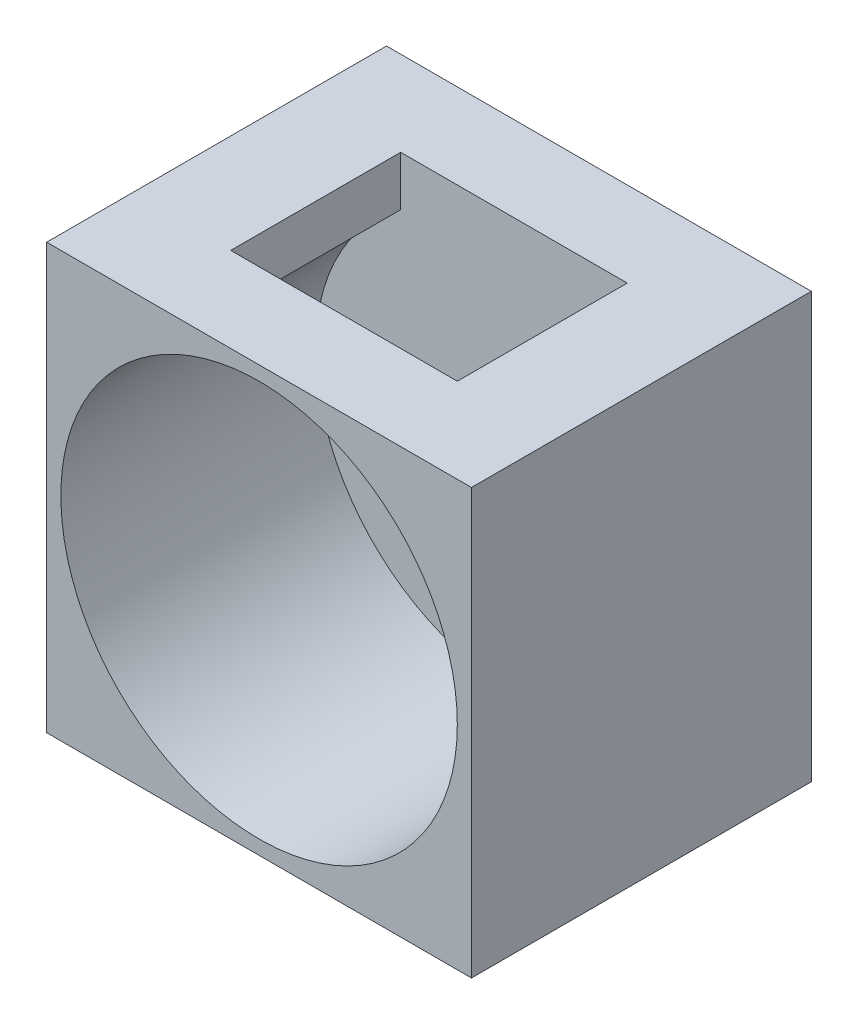
ISO-10303-21;
HEADER;
FILE_DESCRIPTION(('STEP AP214'),'2;1');
FILE_NAME('part.step','',(''),(''),'','','');
FILE_SCHEMA(('AUTOMOTIVE_DESIGN { 1 0 10303 214 1 1 1 1 }'));
ENDSEC;
DATA;
#1=APPLICATION_CONTEXT('core data for automotive mechanical design processes');
#2=APPLICATION_PROTOCOL_DEFINITION('international standard','automotive_design',2000,#1);
#3=PRODUCT_CONTEXT('',#1,'mechanical');
#4=PRODUCT('Part','Part','',(#3));
#5=PRODUCT_RELATED_PRODUCT_CATEGORY('part','',(#4));
#6=PRODUCT_DEFINITION_FORMATION('','',#4);
#7=PRODUCT_DEFINITION_CONTEXT('part definition',#1,'design');
#8=PRODUCT_DEFINITION('design','',#6,#7);
#9=PRODUCT_DEFINITION_SHAPE('','',#8);
#10=(LENGTH_UNIT() NAMED_UNIT(*) SI_UNIT(.MILLI.,.METRE.));
#11=(NAMED_UNIT(*) PLANE_ANGLE_UNIT() SI_UNIT($,.RADIAN.));
#12=(NAMED_UNIT(*) SI_UNIT($,.STERADIAN.) SOLID_ANGLE_UNIT());
#13=UNCERTAINTY_MEASURE_WITH_UNIT(LENGTH_MEASURE(1.E-05),#10,'distance_accuracy_value','');
#14=(GEOMETRIC_REPRESENTATION_CONTEXT(3) GLOBAL_UNCERTAINTY_ASSIGNED_CONTEXT((#13)) GLOBAL_UNIT_ASSIGNED_CONTEXT((#10,
#11,#12)) REPRESENTATION_CONTEXT('',''));
#15=CARTESIAN_POINT('',(0.,0.,0.));
#16=DIRECTION('',(0.,0.,1.));
#17=DIRECTION('',(1.,0.,0.));
#18=AXIS2_PLACEMENT_3D('',#15,#16,#17);
#19=CARTESIAN_POINT('',(7.5,-7.5,12.));
#20=DIRECTION('',(-1.,0.,0.));
#21=DIRECTION('',(0.,0.,1.));
#22=AXIS2_PLACEMENT_3D('',#19,#20,#21);
#23=PLANE('',#22);
#24=DIRECTION('',(0.,1.,0.));
#25=VECTOR('',#24,1.);
#26=CARTESIAN_POINT('',(7.5,-7.5,0.));
#27=LINE('',#26,#25);
#28=CARTESIAN_POINT('',(7.5,-7.5,0.));
#29=VERTEX_POINT('',#28);
#30=CARTESIAN_POINT('',(7.5,7.5,0.));
#31=VERTEX_POINT('',#30);
#32=EDGE_CURVE('E142',#29,#31,#27,.T.);
#33=ORIENTED_EDGE('',*,*,#32,.T.);
#34=DIRECTION('',(0.,0.,-1.));
#35=VECTOR('',#34,1.);
#36=CARTESIAN_POINT('',(7.5,7.5,12.));
#37=LINE('',#36,#35);
#38=CARTESIAN_POINT('',(7.5,7.5,12.));
#39=VERTEX_POINT('',#38);
#40=EDGE_CURVE('E11',#39,#31,#37,.T.);
#41=ORIENTED_EDGE('',*,*,#40,.F.);
#42=DIRECTION('',(0.,1.,0.));
#43=VECTOR('',#42,1.);
#44=CARTESIAN_POINT('',(7.5,-7.5,12.));
#45=LINE('',#44,#43);
#46=CARTESIAN_POINT('',(7.5,-7.5,12.));
#47=VERTEX_POINT('',#46);
#48=EDGE_CURVE('E135',#47,#39,#45,.T.);
#49=ORIENTED_EDGE('',*,*,#48,.F.);
#50=DIRECTION('',(0.,0.,-1.));
#51=VECTOR('',#50,1.);
#52=CARTESIAN_POINT('',(7.5,-7.5,12.));
#53=LINE('',#52,#51);
#54=EDGE_CURVE('E141',#47,#29,#53,.T.);
#55=ORIENTED_EDGE('',*,*,#54,.T.);
#56=EDGE_LOOP('',(#33,#41,#49,#55));
#57=FACE_BOUND('',#56,.T.);
#58=ADVANCED_FACE('F33',(#57),#23,.F.);
#59=CARTESIAN_POINT('',(-7.5,7.5,12.));
#60=DIRECTION('',(0.,-1.,0.));
#61=DIRECTION('',(0.,0.,-1.));
#62=AXIS2_PLACEMENT_3D('',#59,#60,#61);
#63=PLANE('',#62);
#64=DIRECTION('',(-1.,0.,0.));
#65=VECTOR('',#64,1.);
#66=CARTESIAN_POINT('',(4.,7.5,3.));
#67=LINE('',#66,#65);
#68=CARTESIAN_POINT('',(4.,7.5,3.));
#69=VERTEX_POINT('',#68);
#70=CARTESIAN_POINT('',(-4.,7.5,3.));
#71=VERTEX_POINT('',#70);
#72=EDGE_CURVE('E186',#69,#71,#67,.T.);
#73=ORIENTED_EDGE('',*,*,#72,.F.);
#74=DIRECTION('',(0.,0.,-1.));
#75=VECTOR('',#74,1.);
#76=CARTESIAN_POINT('',(4.,7.5,3.));
#77=LINE('',#76,#75);
#78=CARTESIAN_POINT('',(4.,7.5,9.));
#79=VERTEX_POINT('',#78);
#80=EDGE_CURVE('E115',#79,#69,#77,.T.);
#81=ORIENTED_EDGE('',*,*,#80,.F.);
#82=DIRECTION('',(1.,0.,0.));
#83=VECTOR('',#82,1.);
#84=CARTESIAN_POINT('',(4.,7.5,9.));
#85=LINE('',#84,#83);
#86=CARTESIAN_POINT('',(-4.,7.5,9.));
#87=VERTEX_POINT('',#86);
#88=EDGE_CURVE('E126',#87,#79,#85,.T.);
#89=ORIENTED_EDGE('',*,*,#88,.F.);
#90=DIRECTION('',(0.,0.,1.));
#91=VECTOR('',#90,1.);
#92=CARTESIAN_POINT('',(-4.,7.5,3.));
#93=LINE('',#92,#91);
#94=EDGE_CURVE('E131',#71,#87,#93,.T.);
#95=ORIENTED_EDGE('',*,*,#94,.F.);
#96=EDGE_LOOP('',(#73,#81,#89,#95));
#97=FACE_BOUND('',#96,.T.);
#98=DIRECTION('',(-1.,0.,0.));
#99=VECTOR('',#98,1.);
#100=CARTESIAN_POINT('',(-7.5,7.5,0.));
#101=LINE('',#100,#99);
#102=CARTESIAN_POINT('',(-7.5,7.5,0.));
#103=VERTEX_POINT('',#102);
#104=EDGE_CURVE('E145',#31,#103,#101,.T.);
#105=ORIENTED_EDGE('',*,*,#104,.T.);
#106=DIRECTION('',(0.,0.,-1.));
#107=VECTOR('',#106,1.);
#108=CARTESIAN_POINT('',(-7.5,7.5,12.));
#109=LINE('',#108,#107);
#110=CARTESIAN_POINT('',(-7.5,7.5,12.));
#111=VERTEX_POINT('',#110);
#112=EDGE_CURVE('E40',#111,#103,#109,.T.);
#113=ORIENTED_EDGE('',*,*,#112,.F.);
#114=DIRECTION('',(-1.,0.,0.));
#115=VECTOR('',#114,1.);
#116=CARTESIAN_POINT('',(-7.5,7.5,12.));
#117=LINE('',#116,#115);
#118=EDGE_CURVE('E84',#39,#111,#117,.T.);
#119=ORIENTED_EDGE('',*,*,#118,.F.);
#120=ORIENTED_EDGE('',*,*,#40,.T.);
#121=EDGE_LOOP('',(#105,#113,#119,#120));
#122=FACE_BOUND('',#121,.T.);
#123=ADVANCED_FACE('F175',(#97,#122),#63,.F.);
#124=CARTESIAN_POINT('',(-7.5,-7.5,12.));
#125=DIRECTION('',(1.,0.,0.));
#126=DIRECTION('',(0.,0.,-1.));
#127=AXIS2_PLACEMENT_3D('',#124,#125,#126);
#128=PLANE('',#127);
#129=DIRECTION('',(0.,-1.,0.));
#130=VECTOR('',#129,1.);
#131=CARTESIAN_POINT('',(-7.5,-7.5,0.));
#132=LINE('',#131,#130);
#133=CARTESIAN_POINT('',(-7.5,-7.5,0.));
#134=VERTEX_POINT('',#133);
#135=EDGE_CURVE('E148',#103,#134,#132,.T.);
#136=ORIENTED_EDGE('',*,*,#135,.T.);
#137=DIRECTION('',(0.,0.,-1.));
#138=VECTOR('',#137,1.);
#139=CARTESIAN_POINT('',(-7.5,-7.5,12.));
#140=LINE('',#139,#138);
#141=CARTESIAN_POINT('',(-7.5,-7.5,12.));
#142=VERTEX_POINT('',#141);
#143=EDGE_CURVE('E152',#142,#134,#140,.T.);
#144=ORIENTED_EDGE('',*,*,#143,.F.);
#145=DIRECTION('',(0.,-1.,0.));
#146=VECTOR('',#145,1.);
#147=CARTESIAN_POINT('',(-7.5,-7.5,12.));
#148=LINE('',#147,#146);
#149=EDGE_CURVE('E138',#111,#142,#148,.T.);
#150=ORIENTED_EDGE('',*,*,#149,.F.);
#151=ORIENTED_EDGE('',*,*,#112,.T.);
#152=EDGE_LOOP('',(#136,#144,#150,#151));
#153=FACE_BOUND('',#152,.T.);
#154=ADVANCED_FACE('F157',(#153),#128,.F.);
#155=CARTESIAN_POINT('',(-7.5,-7.5,12.));
#156=DIRECTION('',(0.,1.,0.));
#157=DIRECTION('',(-1.,0.,0.));
#158=AXIS2_PLACEMENT_3D('',#155,#156,#157);
#159=PLANE('',#158);
#160=DIRECTION('',(1.,0.,0.));
#161=VECTOR('',#160,1.);
#162=CARTESIAN_POINT('',(-7.5,-7.5,0.));
#163=LINE('',#162,#161);
#164=EDGE_CURVE('E77',#134,#29,#163,.T.);
#165=ORIENTED_EDGE('',*,*,#164,.T.);
#166=ORIENTED_EDGE('',*,*,#54,.F.);
#167=DIRECTION('',(1.,0.,0.));
#168=VECTOR('',#167,1.);
#169=CARTESIAN_POINT('',(-7.5,-7.5,12.));
#170=LINE('',#169,#168);
#171=EDGE_CURVE('E56',#142,#47,#170,.T.);
#172=ORIENTED_EDGE('',*,*,#171,.F.);
#173=ORIENTED_EDGE('',*,*,#143,.T.);
#174=EDGE_LOOP('',(#165,#166,#172,#173));
#175=FACE_BOUND('',#174,.T.);
#176=ADVANCED_FACE('F165',(#175),#159,.F.);
#177=CARTESIAN_POINT('',(0.,0.,12.));
#178=DIRECTION('',(0.,0.,-1.));
#179=DIRECTION('',(-1.,0.,0.));
#180=AXIS2_PLACEMENT_3D('',#177,#178,#179);
#181=PLANE('',#180);
#182=CARTESIAN_POINT('',(0.,0.,12.));
#183=DIRECTION('',(0.,0.,1.));
#184=DIRECTION('',(1.,0.,0.));
#185=AXIS2_PLACEMENT_3D('',#182,#183,#184);
#186=CIRCLE('',#185,7.);
#187=CARTESIAN_POINT('',(7.,0.,12.));
#188=VERTEX_POINT('',#187);
#189=EDGE_CURVE('E121',#188,#188,#186,.T.);
#190=ORIENTED_EDGE('',*,*,#189,.F.);
#191=EDGE_LOOP('',(#190));
#192=FACE_BOUND('',#191,.T.);
#193=ORIENTED_EDGE('',*,*,#48,.T.);
#194=ORIENTED_EDGE('',*,*,#118,.T.);
#195=ORIENTED_EDGE('',*,*,#149,.T.);
#196=ORIENTED_EDGE('',*,*,#171,.T.);
#197=EDGE_LOOP('',(#193,#194,#195,#196));
#198=FACE_BOUND('',#197,.T.);
#199=ADVANCED_FACE('F167',(#192,#198),#181,.F.);
#200=CARTESIAN_POINT('',(0.,0.,0.));
#201=DIRECTION('',(0.,0.,-1.));
#202=DIRECTION('',(-1.,0.,0.));
#203=AXIS2_PLACEMENT_3D('',#200,#201,#202);
#204=PLANE('',#203);
#205=ORIENTED_EDGE('',*,*,#32,.F.);
#206=ORIENTED_EDGE('',*,*,#164,.F.);
#207=ORIENTED_EDGE('',*,*,#135,.F.);
#208=ORIENTED_EDGE('',*,*,#104,.F.);
#209=EDGE_LOOP('',(#205,#206,#207,#208));
#210=FACE_BOUND('',#209,.T.);
#211=ADVANCED_FACE('F161',(#210),#204,.T.);
#212=CARTESIAN_POINT('',(4.,-2.5,3.));
#213=DIRECTION('',(1.,0.,0.));
#214=DIRECTION('',(0.,0.,-1.));
#215=AXIS2_PLACEMENT_3D('',#212,#213,#214);
#216=PLANE('',#215);
#217=DIRECTION('',(0.,1.,0.));
#218=VECTOR('',#217,1.);
#219=CARTESIAN_POINT('',(4.,-2.5,3.));
#220=LINE('',#219,#218);
#221=CARTESIAN_POINT('',(4.,5.74456264653803,3.));
#222=VERTEX_POINT('',#221);
#223=EDGE_CURVE('E47',#222,#69,#220,.T.);
#224=ORIENTED_EDGE('',*,*,#223,.F.);
#225=DIRECTION('',(0.,0.,1.));
#226=VECTOR('',#225,1.);
#227=CARTESIAN_POINT('',(4.,5.74456264653803,3.));
#228=LINE('',#227,#226);
#229=CARTESIAN_POINT('',(4.,5.74456264653803,9.));
#230=VERTEX_POINT('',#229);
#231=EDGE_CURVE('E107',#222,#230,#228,.T.);
#232=ORIENTED_EDGE('',*,*,#231,.T.);
#233=DIRECTION('',(0.,1.,0.));
#234=VECTOR('',#233,1.);
#235=CARTESIAN_POINT('',(4.,-2.5,9.));
#236=LINE('',#235,#234);
#237=EDGE_CURVE('E146',#230,#79,#236,.T.);
#238=ORIENTED_EDGE('',*,*,#237,.T.);
#239=ORIENTED_EDGE('',*,*,#80,.T.);
#240=EDGE_LOOP('',(#224,#232,#238,#239));
#241=FACE_BOUND('',#240,.T.);
#242=ADVANCED_FACE('F123',(#241),#216,.F.);
#243=CARTESIAN_POINT('',(4.,-2.5,9.));
#244=DIRECTION('',(0.,0.,1.));
#245=DIRECTION('',(1.,0.,0.));
#246=AXIS2_PLACEMENT_3D('',#243,#244,#245);
#247=PLANE('',#246);
#248=ORIENTED_EDGE('',*,*,#237,.F.);
#249=CARTESIAN_POINT('',(0.,0.,9.));
#250=DIRECTION('',(0.,0.,1.));
#251=DIRECTION('',(1.,0.,0.));
#252=AXIS2_PLACEMENT_3D('',#249,#250,#251);
#253=CIRCLE('',#252,7.);
#254=CARTESIAN_POINT('',(-4.,5.74456264653803,9.));
#255=VERTEX_POINT('',#254);
#256=EDGE_CURVE('E112',#230,#255,#253,.T.);
#257=ORIENTED_EDGE('',*,*,#256,.T.);
#258=DIRECTION('',(0.,1.,0.));
#259=VECTOR('',#258,1.);
#260=CARTESIAN_POINT('',(-4.,-2.5,9.));
#261=LINE('',#260,#259);
#262=EDGE_CURVE('E128',#255,#87,#261,.T.);
#263=ORIENTED_EDGE('',*,*,#262,.T.);
#264=ORIENTED_EDGE('',*,*,#88,.T.);
#265=EDGE_LOOP('',(#248,#257,#263,#264));
#266=FACE_BOUND('',#265,.T.);
#267=ADVANCED_FACE('F195',(#266),#247,.F.);
#268=CARTESIAN_POINT('',(-4.,-2.5,3.));
#269=DIRECTION('',(-1.,0.,0.));
#270=DIRECTION('',(0.,0.,1.));
#271=AXIS2_PLACEMENT_3D('',#268,#269,#270);
#272=PLANE('',#271);
#273=ORIENTED_EDGE('',*,*,#262,.F.);
#274=DIRECTION('',(0.,0.,1.));
#275=VECTOR('',#274,1.);
#276=CARTESIAN_POINT('',(-4.,5.74456264653803,3.));
#277=LINE('',#276,#275);
#278=CARTESIAN_POINT('',(-4.,5.74456264653803,3.));
#279=VERTEX_POINT('',#278);
#280=EDGE_CURVE('E120',#255,#279,#277,.F.);
#281=ORIENTED_EDGE('',*,*,#280,.T.);
#282=DIRECTION('',(0.,1.,0.));
#283=VECTOR('',#282,1.);
#284=CARTESIAN_POINT('',(-4.,-2.5,3.));
#285=LINE('',#284,#283);
#286=EDGE_CURVE('E119',#279,#71,#285,.T.);
#287=ORIENTED_EDGE('',*,*,#286,.T.);
#288=ORIENTED_EDGE('',*,*,#94,.T.);
#289=EDGE_LOOP('',(#273,#281,#287,#288));
#290=FACE_BOUND('',#289,.T.);
#291=ADVANCED_FACE('F197',(#290),#272,.F.);
#292=CARTESIAN_POINT('',(4.,-2.5,3.));
#293=DIRECTION('',(0.,0.,-1.));
#294=DIRECTION('',(-1.,0.,0.));
#295=AXIS2_PLACEMENT_3D('',#292,#293,#294);
#296=PLANE('',#295);
#297=CARTESIAN_POINT('',(0.,0.,3.));
#298=DIRECTION('',(0.,0.,1.));
#299=DIRECTION('',(1.,0.,0.));
#300=AXIS2_PLACEMENT_3D('',#297,#298,#299);
#301=CIRCLE('',#300,7.);
#302=EDGE_CURVE('E109',#279,#222,#301,.T.);
#303=ORIENTED_EDGE('',*,*,#302,.T.);
#304=ORIENTED_EDGE('',*,*,#223,.T.);
#305=ORIENTED_EDGE('',*,*,#72,.T.);
#306=ORIENTED_EDGE('',*,*,#286,.F.);
#307=EDGE_LOOP('',(#303,#304,#305,#306));
#308=FACE_BOUND('',#307,.T.);
#309=ADVANCED_FACE('F118',(#308),#296,.F.);
#310=CARTESIAN_POINT('',(0.,0.,3.));
#311=DIRECTION('',(0.,0.,1.));
#312=DIRECTION('',(1.,0.,0.));
#313=AXIS2_PLACEMENT_3D('',#310,#311,#312);
#314=CYLINDRICAL_SURFACE('',#313,7.);
#315=ORIENTED_EDGE('',*,*,#189,.T.);
#316=EDGE_LOOP('',(#315));
#317=FACE_BOUND('',#316,.T.);
#318=ORIENTED_EDGE('',*,*,#302,.F.);
#319=ORIENTED_EDGE('',*,*,#280,.F.);
#320=ORIENTED_EDGE('',*,*,#256,.F.);
#321=ORIENTED_EDGE('',*,*,#231,.F.);
#322=EDGE_LOOP('',(#318,#319,#320,#321));
#323=FACE_BOUND('',#322,.T.);
#324=ADVANCED_FACE('F108',(#317,#323),#314,.F.);
#325=CLOSED_SHELL('',(#58,#123,#154,#176,#199,#211,#242,#267,#291,#309,#324));
#326=MANIFOLD_SOLID_BREP('B2',#325);
#327=ADVANCED_BREP_SHAPE_REPRESENTATION('',(#18,#326),#14);
#328=SHAPE_DEFINITION_REPRESENTATION(#9,#327);
ENDSEC;
END-ISO-10303-21;
